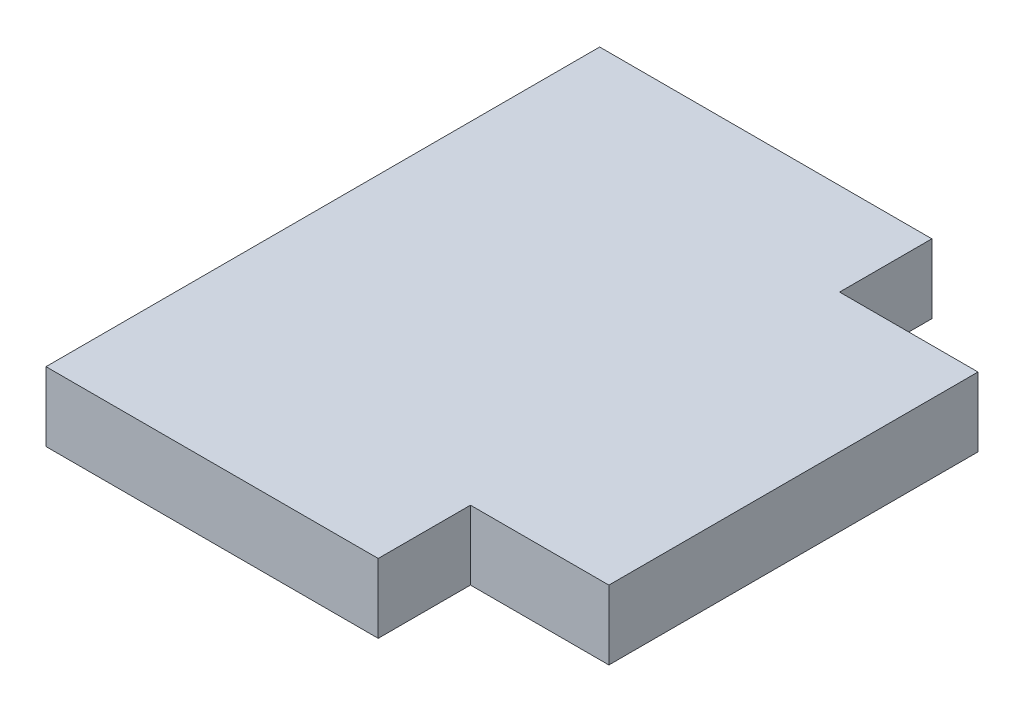
ISO-10303-21;
HEADER;
FILE_DESCRIPTION(('STEP AP214'),'2;1');
FILE_NAME('part.step','',(''),(''),'','','');
FILE_SCHEMA(('AUTOMOTIVE_DESIGN { 1 0 10303 214 1 1 1 1 }'));
ENDSEC;
DATA;
#1=APPLICATION_CONTEXT('core data for automotive mechanical design processes');
#2=APPLICATION_PROTOCOL_DEFINITION('international standard','automotive_design',2000,#1);
#3=PRODUCT_CONTEXT('',#1,'mechanical');
#4=PRODUCT('Part','Part','',(#3));
#5=PRODUCT_RELATED_PRODUCT_CATEGORY('part','',(#4));
#6=PRODUCT_DEFINITION_FORMATION('','',#4);
#7=PRODUCT_DEFINITION_CONTEXT('part definition',#1,'design');
#8=PRODUCT_DEFINITION('design','',#6,#7);
#9=PRODUCT_DEFINITION_SHAPE('','',#8);
#10=(LENGTH_UNIT() NAMED_UNIT(*) SI_UNIT(.MILLI.,.METRE.));
#11=(NAMED_UNIT(*) PLANE_ANGLE_UNIT() SI_UNIT($,.RADIAN.));
#12=(NAMED_UNIT(*) SI_UNIT($,.STERADIAN.) SOLID_ANGLE_UNIT());
#13=UNCERTAINTY_MEASURE_WITH_UNIT(LENGTH_MEASURE(1.E-05),#10,'distance_accuracy_value','');
#14=(GEOMETRIC_REPRESENTATION_CONTEXT(3) GLOBAL_UNCERTAINTY_ASSIGNED_CONTEXT((#13)) GLOBAL_UNIT_ASSIGNED_CONTEXT((#10,
#11,#12)) REPRESENTATION_CONTEXT('',''));
#15=CARTESIAN_POINT('',(0.,0.,0.));
#16=DIRECTION('',(0.,0.,1.));
#17=DIRECTION('',(1.,0.,0.));
#18=AXIS2_PLACEMENT_3D('',#15,#16,#17);
#19=CARTESIAN_POINT('',(0.,1.5,0.));
#20=DIRECTION('',(1.,0.,0.));
#21=DIRECTION('',(0.,0.,-1.));
#22=AXIS2_PLACEMENT_3D('',#19,#20,#21);
#23=PLANE('',#22);
#24=DIRECTION('',(0.,0.,1.));
#25=VECTOR('',#24,1.);
#26=CARTESIAN_POINT('',(0.,0.,0.));
#27=LINE('',#26,#25);
#28=CARTESIAN_POINT('',(0.,0.,-12.));
#29=VERTEX_POINT('',#28);
#30=CARTESIAN_POINT('',(0.,0.,0.));
#31=VERTEX_POINT('',#30);
#32=EDGE_CURVE('E119',#29,#31,#27,.T.);
#33=ORIENTED_EDGE('',*,*,#32,.T.);
#34=DIRECTION('',(0.,-1.,0.));
#35=VECTOR('',#34,1.);
#36=CARTESIAN_POINT('',(0.,1.5,0.));
#37=LINE('',#36,#35);
#38=CARTESIAN_POINT('',(0.,1.5,0.));
#39=VERTEX_POINT('',#38);
#40=EDGE_CURVE('E11',#39,#31,#37,.T.);
#41=ORIENTED_EDGE('',*,*,#40,.F.);
#42=DIRECTION('',(0.,0.,1.));
#43=VECTOR('',#42,1.);
#44=CARTESIAN_POINT('',(0.,1.5,0.));
#45=LINE('',#44,#43);
#46=CARTESIAN_POINT('',(0.,1.5,-12.));
#47=VERTEX_POINT('',#46);
#48=EDGE_CURVE('E127',#47,#39,#45,.T.);
#49=ORIENTED_EDGE('',*,*,#48,.F.);
#50=DIRECTION('',(0.,-1.,0.));
#51=VECTOR('',#50,1.);
#52=CARTESIAN_POINT('',(0.,1.5,-12.));
#53=LINE('',#52,#51);
#54=EDGE_CURVE('E42',#47,#29,#53,.T.);
#55=ORIENTED_EDGE('',*,*,#54,.T.);
#56=EDGE_LOOP('',(#33,#41,#49,#55));
#57=FACE_BOUND('',#56,.T.);
#58=ADVANCED_FACE('F35',(#57),#23,.F.);
#59=CARTESIAN_POINT('',(0.,1.5,0.));
#60=DIRECTION('',(0.,0.,-1.));
#61=DIRECTION('',(-1.,0.,0.));
#62=AXIS2_PLACEMENT_3D('',#59,#60,#61);
#63=PLANE('',#62);
#64=DIRECTION('',(1.,0.,0.));
#65=VECTOR('',#64,1.);
#66=CARTESIAN_POINT('',(0.,0.,0.));
#67=LINE('',#66,#65);
#68=CARTESIAN_POINT('',(7.2,0.,0.));
#69=VERTEX_POINT('',#68);
#70=EDGE_CURVE('E113',#31,#69,#67,.T.);
#71=ORIENTED_EDGE('',*,*,#70,.T.);
#72=DIRECTION('',(0.,1.,0.));
#73=VECTOR('',#72,1.);
#74=CARTESIAN_POINT('',(7.2,0.,0.));
#75=LINE('',#74,#73);
#76=CARTESIAN_POINT('',(7.2,1.5,0.));
#77=VERTEX_POINT('',#76);
#78=EDGE_CURVE('E99',#69,#77,#75,.T.);
#79=ORIENTED_EDGE('',*,*,#78,.T.);
#80=DIRECTION('',(1.,0.,0.));
#81=VECTOR('',#80,1.);
#82=CARTESIAN_POINT('',(0.,1.5,0.));
#83=LINE('',#82,#81);
#84=EDGE_CURVE('E138',#39,#77,#83,.T.);
#85=ORIENTED_EDGE('',*,*,#84,.F.);
#86=ORIENTED_EDGE('',*,*,#40,.T.);
#87=EDGE_LOOP('',(#71,#79,#85,#86));
#88=FACE_BOUND('',#87,.T.);
#89=ADVANCED_FACE('F116',(#88),#63,.F.);
#90=CARTESIAN_POINT('',(10.2,1.5,0.));
#91=DIRECTION('',(-1.,0.,0.));
#92=DIRECTION('',(0.,0.,1.));
#93=AXIS2_PLACEMENT_3D('',#90,#91,#92);
#94=PLANE('',#93);
#95=DIRECTION('',(0.,0.,-1.));
#96=VECTOR('',#95,1.);
#97=CARTESIAN_POINT('',(10.2,1.5,0.));
#98=LINE('',#97,#96);
#99=CARTESIAN_POINT('',(10.2,1.5,-2.));
#100=VERTEX_POINT('',#99);
#101=CARTESIAN_POINT('',(10.2,1.5,-10.));
#102=VERTEX_POINT('',#101);
#103=EDGE_CURVE('E133',#100,#102,#98,.T.);
#104=ORIENTED_EDGE('',*,*,#103,.F.);
#105=DIRECTION('',(0.,1.,0.));
#106=VECTOR('',#105,1.);
#107=CARTESIAN_POINT('',(10.2,0.,-2.));
#108=LINE('',#107,#106);
#109=CARTESIAN_POINT('',(10.2,0.,-2.));
#110=VERTEX_POINT('',#109);
#111=EDGE_CURVE('E106',#110,#100,#108,.T.);
#112=ORIENTED_EDGE('',*,*,#111,.F.);
#113=DIRECTION('',(0.,0.,-1.));
#114=VECTOR('',#113,1.);
#115=CARTESIAN_POINT('',(10.2,0.,0.));
#116=LINE('',#115,#114);
#117=CARTESIAN_POINT('',(10.2,0.,-10.));
#118=VERTEX_POINT('',#117);
#119=EDGE_CURVE('E57',#110,#118,#116,.T.);
#120=ORIENTED_EDGE('',*,*,#119,.T.);
#121=DIRECTION('',(0.,1.,0.));
#122=VECTOR('',#121,1.);
#123=CARTESIAN_POINT('',(10.2,0.,-10.));
#124=LINE('',#123,#122);
#125=EDGE_CURVE('E145',#118,#102,#124,.T.);
#126=ORIENTED_EDGE('',*,*,#125,.T.);
#127=EDGE_LOOP('',(#104,#112,#120,#126));
#128=FACE_BOUND('',#127,.T.);
#129=ADVANCED_FACE('F181',(#128),#94,.F.);
#130=CARTESIAN_POINT('',(0.,1.5,-12.));
#131=DIRECTION('',(0.,0.,1.));
#132=DIRECTION('',(1.,0.,0.));
#133=AXIS2_PLACEMENT_3D('',#130,#131,#132);
#134=PLANE('',#133);
#135=DIRECTION('',(-1.,0.,0.));
#136=VECTOR('',#135,1.);
#137=CARTESIAN_POINT('',(0.,1.5,-12.));
#138=LINE('',#137,#136);
#139=CARTESIAN_POINT('',(7.2,1.5,-12.));
#140=VERTEX_POINT('',#139);
#141=EDGE_CURVE('E129',#140,#47,#138,.T.);
#142=ORIENTED_EDGE('',*,*,#141,.F.);
#143=DIRECTION('',(0.,1.,0.));
#144=VECTOR('',#143,1.);
#145=CARTESIAN_POINT('',(7.2,0.,-12.));
#146=LINE('',#145,#144);
#147=CARTESIAN_POINT('',(7.2,0.,-12.));
#148=VERTEX_POINT('',#147);
#149=EDGE_CURVE('E123',#148,#140,#146,.T.);
#150=ORIENTED_EDGE('',*,*,#149,.F.);
#151=DIRECTION('',(-1.,0.,0.));
#152=VECTOR('',#151,1.);
#153=CARTESIAN_POINT('',(0.,0.,-12.));
#154=LINE('',#153,#152);
#155=EDGE_CURVE('E121',#148,#29,#154,.T.);
#156=ORIENTED_EDGE('',*,*,#155,.T.);
#157=ORIENTED_EDGE('',*,*,#54,.F.);
#158=EDGE_LOOP('',(#142,#150,#156,#157));
#159=FACE_BOUND('',#158,.T.);
#160=ADVANCED_FACE('F174',(#159),#134,.F.);
#161=CARTESIAN_POINT('',(0.,1.5,0.));
#162=DIRECTION('',(0.,-1.,0.));
#163=DIRECTION('',(0.,0.,-1.));
#164=AXIS2_PLACEMENT_3D('',#161,#162,#163);
#165=PLANE('',#164);
#166=ORIENTED_EDGE('',*,*,#84,.T.);
#167=DIRECTION('',(0.,0.,1.));
#168=VECTOR('',#167,1.);
#169=CARTESIAN_POINT('',(7.2,1.5,0.));
#170=LINE('',#169,#168);
#171=CARTESIAN_POINT('',(7.2,1.5,-2.));
#172=VERTEX_POINT('',#171);
#173=EDGE_CURVE('E102',#172,#77,#170,.T.);
#174=ORIENTED_EDGE('',*,*,#173,.F.);
#175=DIRECTION('',(-1.,0.,0.));
#176=VECTOR('',#175,1.);
#177=CARTESIAN_POINT('',(7.2,1.5,-2.));
#178=LINE('',#177,#176);
#179=EDGE_CURVE('E114',#100,#172,#178,.T.);
#180=ORIENTED_EDGE('',*,*,#179,.F.);
#181=ORIENTED_EDGE('',*,*,#103,.T.);
#182=DIRECTION('',(1.,0.,0.));
#183=VECTOR('',#182,1.);
#184=CARTESIAN_POINT('',(7.2,1.5,-10.));
#185=LINE('',#184,#183);
#186=CARTESIAN_POINT('',(7.2,1.5,-10.));
#187=VERTEX_POINT('',#186);
#188=EDGE_CURVE('E149',#187,#102,#185,.T.);
#189=ORIENTED_EDGE('',*,*,#188,.F.);
#190=DIRECTION('',(0.,0.,1.));
#191=VECTOR('',#190,1.);
#192=CARTESIAN_POINT('',(7.2,1.5,-12.));
#193=LINE('',#192,#191);
#194=EDGE_CURVE('E153',#140,#187,#193,.T.);
#195=ORIENTED_EDGE('',*,*,#194,.F.);
#196=ORIENTED_EDGE('',*,*,#141,.T.);
#197=ORIENTED_EDGE('',*,*,#48,.T.);
#198=EDGE_LOOP('',(#166,#174,#180,#181,#189,#195,#196,#197));
#199=FACE_BOUND('',#198,.T.);
#200=ADVANCED_FACE('F170',(#199),#165,.F.);
#201=CARTESIAN_POINT('',(0.,0.,0.));
#202=DIRECTION('',(0.,-1.,0.));
#203=DIRECTION('',(0.,0.,-1.));
#204=AXIS2_PLACEMENT_3D('',#201,#202,#203);
#205=PLANE('',#204);
#206=DIRECTION('',(0.,0.,1.));
#207=VECTOR('',#206,1.);
#208=CARTESIAN_POINT('',(7.2,0.,0.));
#209=LINE('',#208,#207);
#210=CARTESIAN_POINT('',(7.2,0.,-2.));
#211=VERTEX_POINT('',#210);
#212=EDGE_CURVE('E49',#211,#69,#209,.T.);
#213=ORIENTED_EDGE('',*,*,#212,.T.);
#214=ORIENTED_EDGE('',*,*,#70,.F.);
#215=ORIENTED_EDGE('',*,*,#32,.F.);
#216=ORIENTED_EDGE('',*,*,#155,.F.);
#217=DIRECTION('',(0.,0.,1.));
#218=VECTOR('',#217,1.);
#219=CARTESIAN_POINT('',(7.2,0.,-12.));
#220=LINE('',#219,#218);
#221=CARTESIAN_POINT('',(7.2,0.,-10.));
#222=VERTEX_POINT('',#221);
#223=EDGE_CURVE('E152',#148,#222,#220,.T.);
#224=ORIENTED_EDGE('',*,*,#223,.T.);
#225=DIRECTION('',(1.,0.,0.));
#226=VECTOR('',#225,1.);
#227=CARTESIAN_POINT('',(7.2,0.,-10.));
#228=LINE('',#227,#226);
#229=EDGE_CURVE('E146',#222,#118,#228,.T.);
#230=ORIENTED_EDGE('',*,*,#229,.T.);
#231=ORIENTED_EDGE('',*,*,#119,.F.);
#232=DIRECTION('',(-1.,0.,0.));
#233=VECTOR('',#232,1.);
#234=CARTESIAN_POINT('',(7.2,0.,-2.));
#235=LINE('',#234,#233);
#236=EDGE_CURVE('E107',#110,#211,#235,.T.);
#237=ORIENTED_EDGE('',*,*,#236,.T.);
#238=EDGE_LOOP('',(#213,#214,#215,#216,#224,#230,#231,#237));
#239=FACE_BOUND('',#238,.T.);
#240=ADVANCED_FACE('F111',(#239),#205,.T.);
#241=CARTESIAN_POINT('',(7.2,0.,-12.));
#242=DIRECTION('',(-1.,0.,0.));
#243=DIRECTION('',(0.,0.,1.));
#244=AXIS2_PLACEMENT_3D('',#241,#242,#243);
#245=PLANE('',#244);
#246=ORIENTED_EDGE('',*,*,#194,.T.);
#247=DIRECTION('',(0.,1.,0.));
#248=VECTOR('',#247,1.);
#249=CARTESIAN_POINT('',(7.2,0.,-10.));
#250=LINE('',#249,#248);
#251=EDGE_CURVE('E143',#222,#187,#250,.T.);
#252=ORIENTED_EDGE('',*,*,#251,.F.);
#253=ORIENTED_EDGE('',*,*,#223,.F.);
#254=ORIENTED_EDGE('',*,*,#149,.T.);
#255=EDGE_LOOP('',(#246,#252,#253,#254));
#256=FACE_BOUND('',#255,.T.);
#257=ADVANCED_FACE('F176',(#256),#245,.F.);
#258=CARTESIAN_POINT('',(7.2,0.,-10.));
#259=DIRECTION('',(0.,0.,1.));
#260=DIRECTION('',(1.,0.,0.));
#261=AXIS2_PLACEMENT_3D('',#258,#259,#260);
#262=PLANE('',#261);
#263=ORIENTED_EDGE('',*,*,#188,.T.);
#264=ORIENTED_EDGE('',*,*,#125,.F.);
#265=ORIENTED_EDGE('',*,*,#229,.F.);
#266=ORIENTED_EDGE('',*,*,#251,.T.);
#267=EDGE_LOOP('',(#263,#264,#265,#266));
#268=FACE_BOUND('',#267,.T.);
#269=ADVANCED_FACE('F179',(#268),#262,.F.);
#270=CARTESIAN_POINT('',(7.2,0.,0.));
#271=DIRECTION('',(-1.,0.,0.));
#272=DIRECTION('',(0.,0.,1.));
#273=AXIS2_PLACEMENT_3D('',#270,#271,#272);
#274=PLANE('',#273);
#275=ORIENTED_EDGE('',*,*,#173,.T.);
#276=ORIENTED_EDGE('',*,*,#78,.F.);
#277=ORIENTED_EDGE('',*,*,#212,.F.);
#278=DIRECTION('',(0.,1.,0.));
#279=VECTOR('',#278,1.);
#280=CARTESIAN_POINT('',(7.2,0.,-2.));
#281=LINE('',#280,#279);
#282=EDGE_CURVE('E156',#211,#172,#281,.T.);
#283=ORIENTED_EDGE('',*,*,#282,.T.);
#284=EDGE_LOOP('',(#275,#276,#277,#283));
#285=FACE_BOUND('',#284,.T.);
#286=ADVANCED_FACE('F100',(#285),#274,.F.);
#287=CARTESIAN_POINT('',(7.2,0.,-2.));
#288=DIRECTION('',(0.,0.,-1.));
#289=DIRECTION('',(-1.,0.,0.));
#290=AXIS2_PLACEMENT_3D('',#287,#288,#289);
#291=PLANE('',#290);
#292=ORIENTED_EDGE('',*,*,#179,.T.);
#293=ORIENTED_EDGE('',*,*,#282,.F.);
#294=ORIENTED_EDGE('',*,*,#236,.F.);
#295=ORIENTED_EDGE('',*,*,#111,.T.);
#296=EDGE_LOOP('',(#292,#293,#294,#295));
#297=FACE_BOUND('',#296,.T.);
#298=ADVANCED_FACE('F168',(#297),#291,.F.);
#299=CLOSED_SHELL('',(#58,#89,#129,#160,#200,#240,#257,#269,#286,#298));
#300=MANIFOLD_SOLID_BREP('B2',#299);
#301=ADVANCED_BREP_SHAPE_REPRESENTATION('',(#18,#300),#14);
#302=SHAPE_DEFINITION_REPRESENTATION(#9,#301);
ENDSEC;
END-ISO-10303-21;
